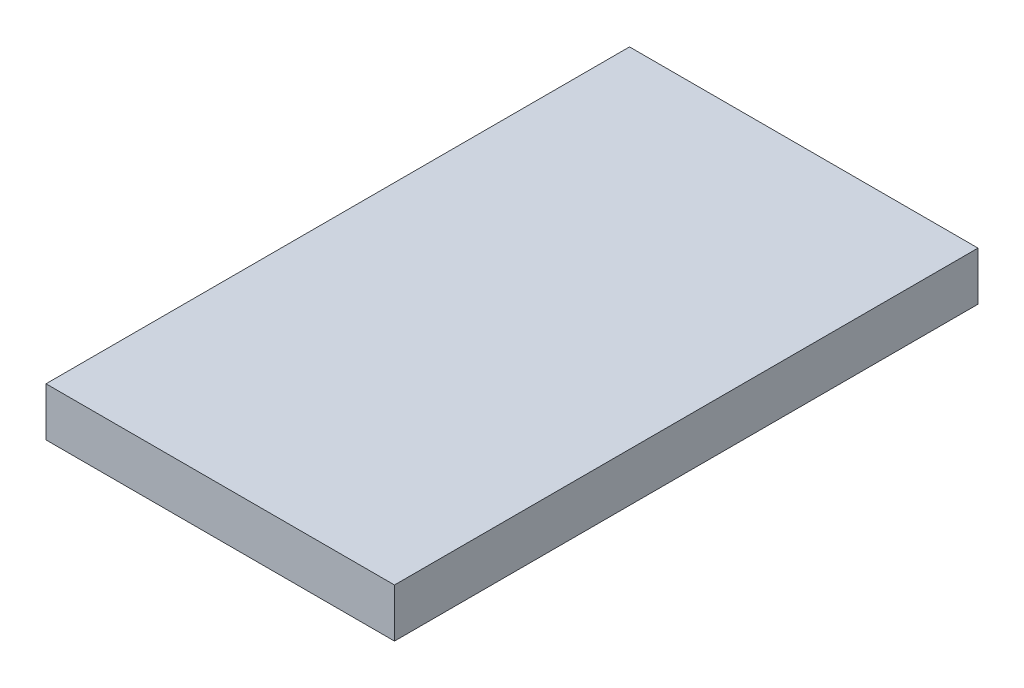
ISO-10303-21;
HEADER;
FILE_DESCRIPTION(('STEP AP214'),'2;1');
FILE_NAME('part.step','',(''),(''),'','','');
FILE_SCHEMA(('AUTOMOTIVE_DESIGN { 1 0 10303 214 1 1 1 1 }'));
ENDSEC;
DATA;
#1=APPLICATION_CONTEXT('core data for automotive mechanical design processes');
#2=APPLICATION_PROTOCOL_DEFINITION('international standard','automotive_design',2000,#1);
#3=PRODUCT_CONTEXT('',#1,'mechanical');
#4=PRODUCT('Part','Part','',(#3));
#5=PRODUCT_RELATED_PRODUCT_CATEGORY('part','',(#4));
#6=PRODUCT_DEFINITION_FORMATION('','',#4);
#7=PRODUCT_DEFINITION_CONTEXT('part definition',#1,'design');
#8=PRODUCT_DEFINITION('design','',#6,#7);
#9=PRODUCT_DEFINITION_SHAPE('','',#8);
#10=(LENGTH_UNIT() NAMED_UNIT(*) SI_UNIT(.MILLI.,.METRE.));
#11=(NAMED_UNIT(*) PLANE_ANGLE_UNIT() SI_UNIT($,.RADIAN.));
#12=(NAMED_UNIT(*) SI_UNIT($,.STERADIAN.) SOLID_ANGLE_UNIT());
#13=UNCERTAINTY_MEASURE_WITH_UNIT(LENGTH_MEASURE(1.E-05),#10,'distance_accuracy_value','');
#14=(GEOMETRIC_REPRESENTATION_CONTEXT(3) GLOBAL_UNCERTAINTY_ASSIGNED_CONTEXT((#13)) GLOBAL_UNIT_ASSIGNED_CONTEXT((#10,
#11,#12)) REPRESENTATION_CONTEXT('',''));
#15=CARTESIAN_POINT('',(0.,0.,0.));
#16=DIRECTION('',(0.,0.,1.));
#17=DIRECTION('',(1.,0.,0.));
#18=AXIS2_PLACEMENT_3D('',#15,#16,#17);
#19=CARTESIAN_POINT('',(21.5,6.,-36.));
#20=DIRECTION('',(-1.,0.,0.));
#21=DIRECTION('',(0.,0.,1.));
#22=AXIS2_PLACEMENT_3D('',#19,#20,#21);
#23=PLANE('',#22);
#24=DIRECTION('',(0.,0.,-1.));
#25=VECTOR('',#24,1.);
#26=CARTESIAN_POINT('',(21.5,0.,-36.));
#27=LINE('',#26,#25);
#28=CARTESIAN_POINT('',(21.5,0.,36.));
#29=VERTEX_POINT('',#28);
#30=CARTESIAN_POINT('',(21.5,0.,-36.));
#31=VERTEX_POINT('',#30);
#32=EDGE_CURVE('E96',#29,#31,#27,.T.);
#33=ORIENTED_EDGE('',*,*,#32,.T.);
#34=DIRECTION('',(0.,-1.,0.));
#35=VECTOR('',#34,1.);
#36=CARTESIAN_POINT('',(21.5,6.,-36.));
#37=LINE('',#36,#35);
#38=CARTESIAN_POINT('',(21.5,6.,-36.));
#39=VERTEX_POINT('',#38);
#40=EDGE_CURVE('E11',#39,#31,#37,.T.);
#41=ORIENTED_EDGE('',*,*,#40,.F.);
#42=DIRECTION('',(0.,0.,-1.));
#43=VECTOR('',#42,1.);
#44=CARTESIAN_POINT('',(21.5,6.,-36.));
#45=LINE('',#44,#43);
#46=CARTESIAN_POINT('',(21.5,6.,36.));
#47=VERTEX_POINT('',#46);
#48=EDGE_CURVE('E84',#47,#39,#45,.T.);
#49=ORIENTED_EDGE('',*,*,#48,.F.);
#50=DIRECTION('',(0.,-1.,0.));
#51=VECTOR('',#50,1.);
#52=CARTESIAN_POINT('',(21.5,6.,36.));
#53=LINE('',#52,#51);
#54=EDGE_CURVE('E92',#47,#29,#53,.T.);
#55=ORIENTED_EDGE('',*,*,#54,.T.);
#56=EDGE_LOOP('',(#33,#41,#49,#55));
#57=FACE_BOUND('',#56,.T.);
#58=ADVANCED_FACE('F33',(#57),#23,.F.);
#59=CARTESIAN_POINT('',(-21.5,6.,-36.));
#60=DIRECTION('',(0.,0.,1.));
#61=DIRECTION('',(1.,0.,0.));
#62=AXIS2_PLACEMENT_3D('',#59,#60,#61);
#63=PLANE('',#62);
#64=DIRECTION('',(-1.,0.,0.));
#65=VECTOR('',#64,1.);
#66=CARTESIAN_POINT('',(-21.5,0.,-36.));
#67=LINE('',#66,#65);
#68=CARTESIAN_POINT('',(-21.5,0.,-36.));
#69=VERTEX_POINT('',#68);
#70=EDGE_CURVE('E88',#31,#69,#67,.T.);
#71=ORIENTED_EDGE('',*,*,#70,.T.);
#72=DIRECTION('',(0.,-1.,0.));
#73=VECTOR('',#72,1.);
#74=CARTESIAN_POINT('',(-21.5,6.,-36.));
#75=LINE('',#74,#73);
#76=CARTESIAN_POINT('',(-21.5,6.,-36.));
#77=VERTEX_POINT('',#76);
#78=EDGE_CURVE('E41',#77,#69,#75,.T.);
#79=ORIENTED_EDGE('',*,*,#78,.F.);
#80=DIRECTION('',(-1.,0.,0.));
#81=VECTOR('',#80,1.);
#82=CARTESIAN_POINT('',(-21.5,6.,-36.));
#83=LINE('',#82,#81);
#84=EDGE_CURVE('E79',#39,#77,#83,.T.);
#85=ORIENTED_EDGE('',*,*,#84,.F.);
#86=ORIENTED_EDGE('',*,*,#40,.T.);
#87=EDGE_LOOP('',(#71,#79,#85,#86));
#88=FACE_BOUND('',#87,.T.);
#89=ADVANCED_FACE('F87',(#88),#63,.F.);
#90=CARTESIAN_POINT('',(-21.5,6.,-36.));
#91=DIRECTION('',(1.,0.,0.));
#92=DIRECTION('',(0.,0.,-1.));
#93=AXIS2_PLACEMENT_3D('',#90,#91,#92);
#94=PLANE('',#93);
#95=DIRECTION('',(0.,0.,1.));
#96=VECTOR('',#95,1.);
#97=CARTESIAN_POINT('',(-21.5,0.,-36.));
#98=LINE('',#97,#96);
#99=CARTESIAN_POINT('',(-21.5,0.,36.));
#100=VERTEX_POINT('',#99);
#101=EDGE_CURVE('E66',#69,#100,#98,.T.);
#102=ORIENTED_EDGE('',*,*,#101,.T.);
#103=DIRECTION('',(0.,-1.,0.));
#104=VECTOR('',#103,1.);
#105=CARTESIAN_POINT('',(-21.5,6.,36.));
#106=LINE('',#105,#104);
#107=CARTESIAN_POINT('',(-21.5,6.,36.));
#108=VERTEX_POINT('',#107);
#109=EDGE_CURVE('E89',#108,#100,#106,.T.);
#110=ORIENTED_EDGE('',*,*,#109,.F.);
#111=DIRECTION('',(0.,0.,1.));
#112=VECTOR('',#111,1.);
#113=CARTESIAN_POINT('',(-21.5,6.,-36.));
#114=LINE('',#113,#112);
#115=EDGE_CURVE('E82',#77,#108,#114,.T.);
#116=ORIENTED_EDGE('',*,*,#115,.F.);
#117=ORIENTED_EDGE('',*,*,#78,.T.);
#118=EDGE_LOOP('',(#102,#110,#116,#117));
#119=FACE_BOUND('',#118,.T.);
#120=ADVANCED_FACE('F90',(#119),#94,.F.);
#121=CARTESIAN_POINT('',(-21.5,6.,36.));
#122=DIRECTION('',(0.,0.,-1.));
#123=DIRECTION('',(-1.,0.,0.));
#124=AXIS2_PLACEMENT_3D('',#121,#122,#123);
#125=PLANE('',#124);
#126=DIRECTION('',(1.,0.,0.));
#127=VECTOR('',#126,1.);
#128=CARTESIAN_POINT('',(-21.5,0.,36.));
#129=LINE('',#128,#127);
#130=EDGE_CURVE('E72',#100,#29,#129,.T.);
#131=ORIENTED_EDGE('',*,*,#130,.T.);
#132=ORIENTED_EDGE('',*,*,#54,.F.);
#133=DIRECTION('',(1.,0.,0.));
#134=VECTOR('',#133,1.);
#135=CARTESIAN_POINT('',(-21.5,6.,36.));
#136=LINE('',#135,#134);
#137=EDGE_CURVE('E49',#108,#47,#136,.T.);
#138=ORIENTED_EDGE('',*,*,#137,.F.);
#139=ORIENTED_EDGE('',*,*,#109,.T.);
#140=EDGE_LOOP('',(#131,#132,#138,#139));
#141=FACE_BOUND('',#140,.T.);
#142=ADVANCED_FACE('F103',(#141),#125,.F.);
#143=CARTESIAN_POINT('',(0.,6.,0.));
#144=DIRECTION('',(0.,1.,0.));
#145=DIRECTION('',(0.,0.,1.));
#146=AXIS2_PLACEMENT_3D('',#143,#144,#145);
#147=PLANE('',#146);
#148=ORIENTED_EDGE('',*,*,#48,.T.);
#149=ORIENTED_EDGE('',*,*,#84,.T.);
#150=ORIENTED_EDGE('',*,*,#115,.T.);
#151=ORIENTED_EDGE('',*,*,#137,.T.);
#152=EDGE_LOOP('',(#148,#149,#150,#151));
#153=FACE_BOUND('',#152,.T.);
#154=ADVANCED_FACE('F80',(#153),#147,.T.);
#155=CARTESIAN_POINT('',(0.,0.,0.));
#156=DIRECTION('',(0.,1.,0.));
#157=DIRECTION('',(0.,0.,1.));
#158=AXIS2_PLACEMENT_3D('',#155,#156,#157);
#159=PLANE('',#158);
#160=ORIENTED_EDGE('',*,*,#32,.F.);
#161=ORIENTED_EDGE('',*,*,#130,.F.);
#162=ORIENTED_EDGE('',*,*,#101,.F.);
#163=ORIENTED_EDGE('',*,*,#70,.F.);
#164=EDGE_LOOP('',(#160,#161,#162,#163));
#165=FACE_BOUND('',#164,.T.);
#166=ADVANCED_FACE('F106',(#165),#159,.F.);
#167=CLOSED_SHELL('',(#58,#89,#120,#142,#154,#166));
#168=MANIFOLD_SOLID_BREP('B2',#167);
#169=ADVANCED_BREP_SHAPE_REPRESENTATION('',(#18,#168),#14);
#170=SHAPE_DEFINITION_REPRESENTATION(#9,#169);
ENDSEC;
END-ISO-10303-21;
